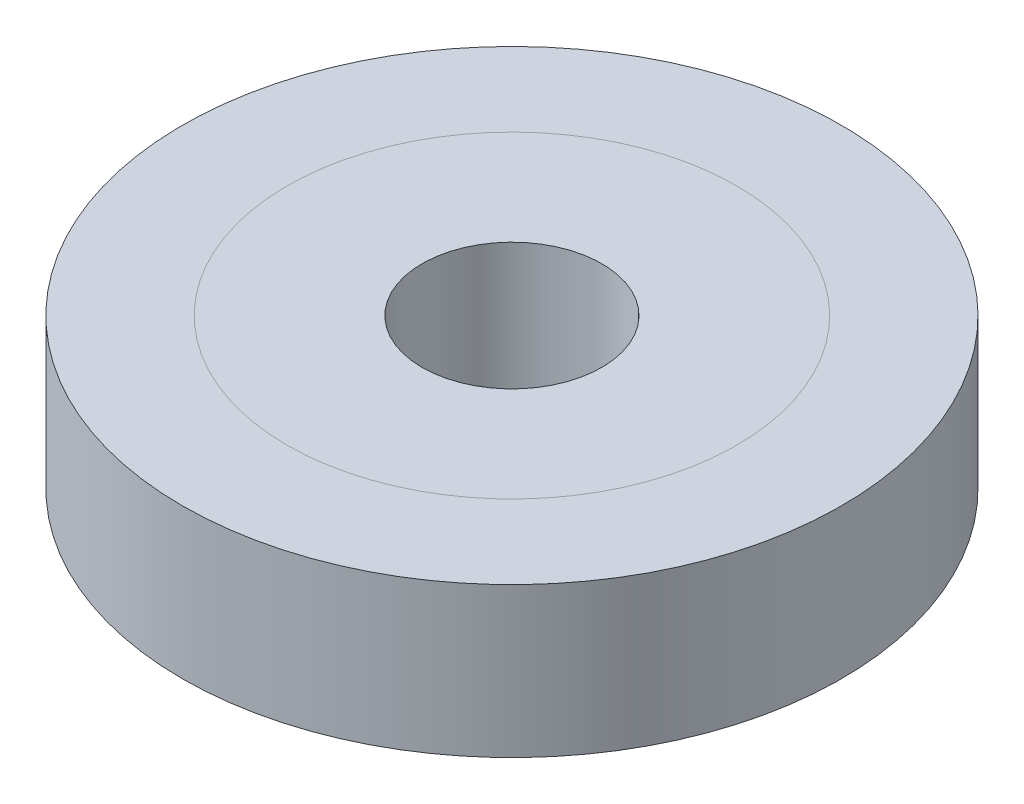
ISO-10303-21;
HEADER;
FILE_DESCRIPTION(('STEP AP214'),'2;1');
FILE_NAME('part.step','',(''),(''),'','','');
FILE_SCHEMA(('AUTOMOTIVE_DESIGN { 1 0 10303 214 1 1 1 1 }'));
ENDSEC;
DATA;
#1=APPLICATION_CONTEXT('core data for automotive mechanical design processes');
#2=APPLICATION_PROTOCOL_DEFINITION('international standard','automotive_design',2000,#1);
#3=PRODUCT_CONTEXT('',#1,'mechanical');
#4=PRODUCT('Part','Part','',(#3));
#5=PRODUCT_RELATED_PRODUCT_CATEGORY('part','',(#4));
#6=PRODUCT_DEFINITION_FORMATION('','',#4);
#7=PRODUCT_DEFINITION_CONTEXT('part definition',#1,'design');
#8=PRODUCT_DEFINITION('design','',#6,#7);
#9=PRODUCT_DEFINITION_SHAPE('','',#8);
#10=(LENGTH_UNIT() NAMED_UNIT(*) SI_UNIT(.MILLI.,.METRE.));
#11=(NAMED_UNIT(*) PLANE_ANGLE_UNIT() SI_UNIT($,.RADIAN.));
#12=(NAMED_UNIT(*) SI_UNIT($,.STERADIAN.) SOLID_ANGLE_UNIT());
#13=UNCERTAINTY_MEASURE_WITH_UNIT(LENGTH_MEASURE(1.E-05),#10,'distance_accuracy_value','');
#14=(GEOMETRIC_REPRESENTATION_CONTEXT(3) GLOBAL_UNCERTAINTY_ASSIGNED_CONTEXT((#13)) GLOBAL_UNIT_ASSIGNED_CONTEXT((#10,
#11,#12)) REPRESENTATION_CONTEXT('',''));
#15=CARTESIAN_POINT('',(0.,0.,0.));
#16=DIRECTION('',(0.,0.,1.));
#17=DIRECTION('',(1.,0.,0.));
#18=AXIS2_PLACEMENT_3D('',#15,#16,#17);
#19=CARTESIAN_POINT('',(0.,2.5,0.));
#20=DIRECTION('',(0.,1.,0.));
#21=DIRECTION('',(0.,0.,1.));
#22=AXIS2_PLACEMENT_3D('',#19,#20,#21);
#23=PLANE('',#22);
#24=CARTESIAN_POINT('',(0.,2.5,0.));
#25=DIRECTION('',(0.,1.,0.));
#26=DIRECTION('',(0.,0.,1.));
#27=AXIS2_PLACEMENT_3D('',#24,#25,#26);
#28=CIRCLE('',#27,11.);
#29=CARTESIAN_POINT('',(0.,2.5,11.));
#30=VERTEX_POINT('',#29);
#31=EDGE_CURVE('E11',#30,#30,#28,.T.);
#32=ORIENTED_EDGE('',*,*,#31,.T.);
#33=EDGE_LOOP('',(#32));
#34=FACE_BOUND('',#33,.T.);
#35=CARTESIAN_POINT('',(0.,2.5,0.));
#36=DIRECTION('',(0.,1.,0.));
#37=DIRECTION('',(0.,0.,1.));
#38=AXIS2_PLACEMENT_3D('',#35,#36,#37);
#39=CIRCLE('',#38,7.5);
#40=CARTESIAN_POINT('',(0.,2.5,7.5));
#41=VERTEX_POINT('',#40);
#42=EDGE_CURVE('E58',#41,#41,#39,.T.);
#43=ORIENTED_EDGE('',*,*,#42,.F.);
#44=EDGE_LOOP('',(#43));
#45=FACE_BOUND('',#44,.T.);
#46=ADVANCED_FACE('F47',(#34,#45),#23,.T.);
#47=CARTESIAN_POINT('',(0.,-2.5,0.));
#48=DIRECTION('',(0.,1.,0.));
#49=DIRECTION('',(0.,0.,1.));
#50=AXIS2_PLACEMENT_3D('',#47,#48,#49);
#51=PLANE('',#50);
#52=CARTESIAN_POINT('',(0.,-2.5,0.));
#53=DIRECTION('',(0.,1.,0.));
#54=DIRECTION('',(0.,0.,1.));
#55=AXIS2_PLACEMENT_3D('',#52,#53,#54);
#56=CIRCLE('',#55,11.);
#57=CARTESIAN_POINT('',(0.,-2.5,11.));
#58=VERTEX_POINT('',#57);
#59=EDGE_CURVE('E51',#58,#58,#56,.T.);
#60=ORIENTED_EDGE('',*,*,#59,.F.);
#61=EDGE_LOOP('',(#60));
#62=FACE_BOUND('',#61,.T.);
#63=CARTESIAN_POINT('',(0.,-2.5,0.));
#64=DIRECTION('',(0.,1.,0.));
#65=DIRECTION('',(0.,0.,1.));
#66=AXIS2_PLACEMENT_3D('',#63,#64,#65);
#67=CIRCLE('',#66,7.5);
#68=CARTESIAN_POINT('',(0.,-2.5,7.5));
#69=VERTEX_POINT('',#68);
#70=EDGE_CURVE('E60',#69,#69,#67,.T.);
#71=ORIENTED_EDGE('',*,*,#70,.T.);
#72=EDGE_LOOP('',(#71));
#73=FACE_BOUND('',#72,.T.);
#74=ADVANCED_FACE('F70',(#62,#73),#51,.F.);
#75=CARTESIAN_POINT('',(0.,2.5,0.));
#76=DIRECTION('',(0.,-1.,0.));
#77=DIRECTION('',(0.,0.,-1.));
#78=AXIS2_PLACEMENT_3D('',#75,#76,#77);
#79=CYLINDRICAL_SURFACE('',#78,11.);
#80=ORIENTED_EDGE('',*,*,#31,.F.);
#81=EDGE_LOOP('',(#80));
#82=FACE_BOUND('',#81,.T.);
#83=ORIENTED_EDGE('',*,*,#59,.T.);
#84=EDGE_LOOP('',(#83));
#85=FACE_BOUND('',#84,.T.);
#86=ADVANCED_FACE('F49',(#82,#85),#79,.T.);
#87=CARTESIAN_POINT('',(0.,2.5,0.));
#88=DIRECTION('',(0.,-1.,0.));
#89=DIRECTION('',(0.,0.,-1.));
#90=AXIS2_PLACEMENT_3D('',#87,#88,#89);
#91=CYLINDRICAL_SURFACE('',#90,7.5);
#92=ORIENTED_EDGE('',*,*,#42,.T.);
#93=EDGE_LOOP('',(#92));
#94=FACE_BOUND('',#93,.T.);
#95=ORIENTED_EDGE('',*,*,#70,.F.);
#96=EDGE_LOOP('',(#95));
#97=FACE_BOUND('',#96,.T.);
#98=ADVANCED_FACE('F66',(#94,#97),#91,.F.);
#99=CLOSED_SHELL('',(#46,#74,#86,#98));
#100=MANIFOLD_SOLID_BREP('B2',#99);
#101=CARTESIAN_POINT('',(0.,2.5,0.));
#102=DIRECTION('',(0.,1.,0.));
#103=DIRECTION('',(0.,0.,1.));
#104=AXIS2_PLACEMENT_3D('',#101,#102,#103);
#105=PLANE('',#104);
#106=CARTESIAN_POINT('',(0.,2.5,0.));
#107=DIRECTION('',(0.,1.,0.));
#108=DIRECTION('',(0.,0.,1.));
#109=AXIS2_PLACEMENT_3D('',#106,#107,#108);
#110=CIRCLE('',#109,7.5);
#111=CARTESIAN_POINT('',(0.,2.5,7.5));
#112=VERTEX_POINT('',#111);
#113=EDGE_CURVE('E46',#112,#112,#110,.T.);
#114=ORIENTED_EDGE('',*,*,#113,.T.);
#115=EDGE_LOOP('',(#114));
#116=FACE_BOUND('',#115,.T.);
#117=CARTESIAN_POINT('',(0.,2.5,0.));
#118=DIRECTION('',(0.,1.,0.));
#119=DIRECTION('',(0.,0.,1.));
#120=AXIS2_PLACEMENT_3D('',#117,#118,#119);
#121=CIRCLE('',#120,3.);
#122=CARTESIAN_POINT('',(0.,2.5,3.));
#123=VERTEX_POINT('',#122);
#124=EDGE_CURVE('E112',#123,#123,#121,.T.);
#125=ORIENTED_EDGE('',*,*,#124,.F.);
#126=EDGE_LOOP('',(#125));
#127=FACE_BOUND('',#126,.T.);
#128=ADVANCED_FACE('F101',(#116,#127),#105,.T.);
#129=CARTESIAN_POINT('',(0.,-2.5,0.));
#130=DIRECTION('',(0.,1.,0.));
#131=DIRECTION('',(0.,0.,1.));
#132=AXIS2_PLACEMENT_3D('',#129,#130,#131);
#133=PLANE('',#132);
#134=CARTESIAN_POINT('',(0.,-2.5,0.));
#135=DIRECTION('',(0.,1.,0.));
#136=DIRECTION('',(0.,0.,1.));
#137=AXIS2_PLACEMENT_3D('',#134,#135,#136);
#138=CIRCLE('',#137,7.5);
#139=CARTESIAN_POINT('',(0.,-2.5,7.5));
#140=VERTEX_POINT('',#139);
#141=EDGE_CURVE('E105',#140,#140,#138,.T.);
#142=ORIENTED_EDGE('',*,*,#141,.F.);
#143=EDGE_LOOP('',(#142));
#144=FACE_BOUND('',#143,.T.);
#145=CARTESIAN_POINT('',(0.,-2.5,0.));
#146=DIRECTION('',(0.,1.,0.));
#147=DIRECTION('',(0.,0.,1.));
#148=AXIS2_PLACEMENT_3D('',#145,#146,#147);
#149=CIRCLE('',#148,3.);
#150=CARTESIAN_POINT('',(0.,-2.5,3.));
#151=VERTEX_POINT('',#150);
#152=EDGE_CURVE('E114',#151,#151,#149,.T.);
#153=ORIENTED_EDGE('',*,*,#152,.T.);
#154=EDGE_LOOP('',(#153));
#155=FACE_BOUND('',#154,.T.);
#156=ADVANCED_FACE('F124',(#144,#155),#133,.F.);
#157=CARTESIAN_POINT('',(0.,2.5,0.));
#158=DIRECTION('',(0.,-1.,0.));
#159=DIRECTION('',(0.,0.,-1.));
#160=AXIS2_PLACEMENT_3D('',#157,#158,#159);
#161=CYLINDRICAL_SURFACE('',#160,7.5);
#162=ORIENTED_EDGE('',*,*,#113,.F.);
#163=EDGE_LOOP('',(#162));
#164=FACE_BOUND('',#163,.T.);
#165=ORIENTED_EDGE('',*,*,#141,.T.);
#166=EDGE_LOOP('',(#165));
#167=FACE_BOUND('',#166,.T.);
#168=ADVANCED_FACE('F103',(#164,#167),#161,.T.);
#169=CARTESIAN_POINT('',(0.,2.5,0.));
#170=DIRECTION('',(0.,-1.,0.));
#171=DIRECTION('',(0.,0.,-1.));
#172=AXIS2_PLACEMENT_3D('',#169,#170,#171);
#173=CYLINDRICAL_SURFACE('',#172,3.);
#174=ORIENTED_EDGE('',*,*,#124,.T.);
#175=EDGE_LOOP('',(#174));
#176=FACE_BOUND('',#175,.T.);
#177=ORIENTED_EDGE('',*,*,#152,.F.);
#178=EDGE_LOOP('',(#177));
#179=FACE_BOUND('',#178,.T.);
#180=ADVANCED_FACE('F120',(#176,#179),#173,.F.);
#181=CLOSED_SHELL('',(#128,#156,#168,#180));
#182=MANIFOLD_SOLID_BREP('B6',#181);
#183=ADVANCED_BREP_SHAPE_REPRESENTATION('',(#18,#100,#182),#14);
#184=SHAPE_DEFINITION_REPRESENTATION(#9,#183);
ENDSEC;
END-ISO-10303-21;
